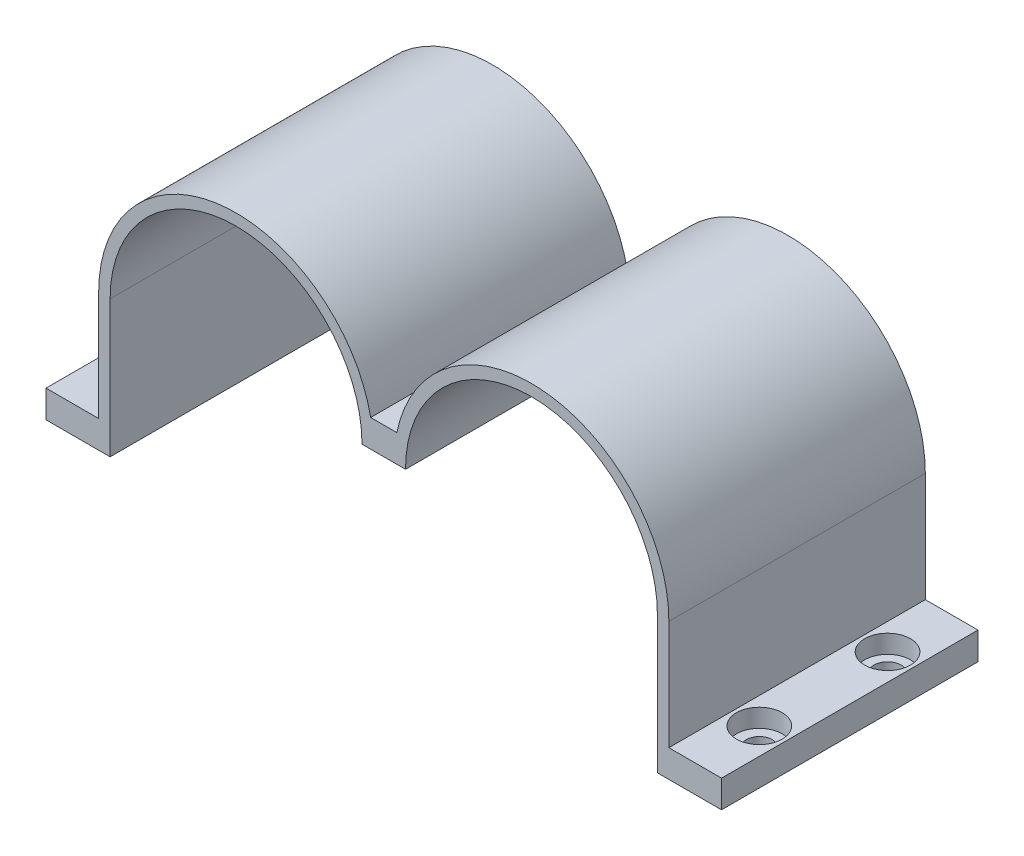
ISO-10303-21;
HEADER;
FILE_DESCRIPTION(('STEP AP214'),'2;1');
FILE_NAME('part.step','',(''),(''),'','','');
FILE_SCHEMA(('AUTOMOTIVE_DESIGN { 1 0 10303 214 1 1 1 1 }'));
ENDSEC;
DATA;
#1=APPLICATION_CONTEXT('core data for automotive mechanical design processes');
#2=APPLICATION_PROTOCOL_DEFINITION('international standard','automotive_design',2000,#1);
#3=PRODUCT_CONTEXT('',#1,'mechanical');
#4=PRODUCT('Part','Part','',(#3));
#5=PRODUCT_RELATED_PRODUCT_CATEGORY('part','',(#4));
#6=PRODUCT_DEFINITION_FORMATION('','',#4);
#7=PRODUCT_DEFINITION_CONTEXT('part definition',#1,'design');
#8=PRODUCT_DEFINITION('design','',#6,#7);
#9=PRODUCT_DEFINITION_SHAPE('','',#8);
#10=(LENGTH_UNIT() NAMED_UNIT(*) SI_UNIT(.MILLI.,.METRE.));
#11=(NAMED_UNIT(*) PLANE_ANGLE_UNIT() SI_UNIT($,.RADIAN.));
#12=(NAMED_UNIT(*) SI_UNIT($,.STERADIAN.) SOLID_ANGLE_UNIT());
#13=UNCERTAINTY_MEASURE_WITH_UNIT(LENGTH_MEASURE(1.E-05),#10,'distance_accuracy_value','');
#14=(GEOMETRIC_REPRESENTATION_CONTEXT(3) GLOBAL_UNCERTAINTY_ASSIGNED_CONTEXT((#13)) GLOBAL_UNIT_ASSIGNED_CONTEXT((#10,
#11,#12)) REPRESENTATION_CONTEXT('',''));
#15=CARTESIAN_POINT('',(0.,0.,0.));
#16=DIRECTION('',(0.,0.,1.));
#17=DIRECTION('',(1.,0.,0.));
#18=AXIS2_PLACEMENT_3D('',#15,#16,#17);
#19=CARTESIAN_POINT('',(31.125,0.,-28.));
#20=DIRECTION('',(1.,0.,0.));
#21=DIRECTION('',(0.,0.,-1.));
#22=AXIS2_PLACEMENT_3D('',#19,#20,#21);
#23=PLANE('',#22);
#24=DIRECTION('',(0.,1.,0.));
#25=VECTOR('',#24,1.);
#26=CARTESIAN_POINT('',(31.125,0.,0.));
#27=LINE('',#26,#25);
#28=CARTESIAN_POINT('',(31.125,-11.9452316579754,0.));
#29=VERTEX_POINT('',#28);
#30=CARTESIAN_POINT('',(31.125,0.,0.));
#31=VERTEX_POINT('',#30);
#32=EDGE_CURVE('E193',#29,#31,#27,.T.);
#33=ORIENTED_EDGE('',*,*,#32,.F.);
#34=DIRECTION('',(0.,0.,1.));
#35=VECTOR('',#34,1.);
#36=CARTESIAN_POINT('',(31.125,-11.9452316579754,-28.));
#37=LINE('',#36,#35);
#38=CARTESIAN_POINT('',(31.125,-11.9452316579754,-28.));
#39=VERTEX_POINT('',#38);
#40=EDGE_CURVE('E11',#39,#29,#37,.T.);
#41=ORIENTED_EDGE('',*,*,#40,.F.);
#42=DIRECTION('',(0.,1.,0.));
#43=VECTOR('',#42,1.);
#44=CARTESIAN_POINT('',(31.125,0.,-28.));
#45=LINE('',#44,#43);
#46=CARTESIAN_POINT('',(31.125,0.,-28.));
#47=VERTEX_POINT('',#46);
#48=EDGE_CURVE('E250',#39,#47,#45,.T.);
#49=ORIENTED_EDGE('',*,*,#48,.T.);
#50=DIRECTION('',(0.,0.,1.));
#51=VECTOR('',#50,1.);
#52=CARTESIAN_POINT('',(31.125,0.,-28.));
#53=LINE('',#52,#51);
#54=EDGE_CURVE('E44',#47,#31,#53,.T.);
#55=ORIENTED_EDGE('',*,*,#54,.T.);
#56=EDGE_LOOP('',(#33,#41,#49,#55));
#57=FACE_BOUND('',#56,.T.);
#58=ADVANCED_FACE('F41',(#57),#23,.T.);
#59=CARTESIAN_POINT('',(0.,-11.9452316579754,-28.));
#60=DIRECTION('',(0.,-1.,0.));
#61=DIRECTION('',(0.,0.,-1.));
#62=AXIS2_PLACEMENT_3D('',#59,#60,#61);
#63=PLANE('',#62);
#64=CARTESIAN_POINT('',(34.,-11.9452316579754,-21.));
#65=DIRECTION('',(0.,1.,0.));
#66=DIRECTION('',(1.,0.,0.));
#67=AXIS2_PLACEMENT_3D('',#64,#65,#66);
#68=CIRCLE('',#67,2.5);
#69=CARTESIAN_POINT('',(36.5,-11.9452316579754,-21.));
#70=VERTEX_POINT('',#69);
#71=EDGE_CURVE('E490',#70,#70,#68,.T.);
#72=ORIENTED_EDGE('',*,*,#71,.F.);
#73=EDGE_LOOP('',(#72));
#74=FACE_BOUND('',#73,.T.);
#75=CARTESIAN_POINT('',(34.,-11.9452316579754,-7.));
#76=DIRECTION('',(0.,1.,0.));
#77=DIRECTION('',(1.,0.,0.));
#78=AXIS2_PLACEMENT_3D('',#75,#76,#77);
#79=CIRCLE('',#78,2.5);
#80=CARTESIAN_POINT('',(36.5,-11.9452316579754,-7.));
#81=VERTEX_POINT('',#80);
#82=EDGE_CURVE('E503',#81,#81,#79,.T.);
#83=ORIENTED_EDGE('',*,*,#82,.F.);
#84=EDGE_LOOP('',(#83));
#85=FACE_BOUND('',#84,.T.);
#86=DIRECTION('',(1.,0.,0.));
#87=VECTOR('',#86,1.);
#88=CARTESIAN_POINT('',(0.,-11.9452316579754,0.));
#89=LINE('',#88,#87);
#90=CARTESIAN_POINT('',(36.875,-11.9452316579754,0.));
#91=VERTEX_POINT('',#90);
#92=EDGE_CURVE('E248',#29,#91,#89,.T.);
#93=ORIENTED_EDGE('',*,*,#92,.T.);
#94=DIRECTION('',(0.,0.,1.));
#95=VECTOR('',#94,1.);
#96=CARTESIAN_POINT('',(36.875,-11.9452316579754,-28.));
#97=LINE('',#96,#95);
#98=CARTESIAN_POINT('',(36.875,-11.9452316579754,-28.));
#99=VERTEX_POINT('',#98);
#100=EDGE_CURVE('E51',#99,#91,#97,.T.);
#101=ORIENTED_EDGE('',*,*,#100,.F.);
#102=DIRECTION('',(1.,0.,0.));
#103=VECTOR('',#102,1.);
#104=CARTESIAN_POINT('',(0.,-11.9452316579754,-28.));
#105=LINE('',#104,#103);
#106=EDGE_CURVE('E179',#39,#99,#105,.T.);
#107=ORIENTED_EDGE('',*,*,#106,.F.);
#108=ORIENTED_EDGE('',*,*,#40,.T.);
#109=EDGE_LOOP('',(#93,#101,#107,#108));
#110=FACE_BOUND('',#109,.T.);
#111=ADVANCED_FACE('F296',(#74,#85,#110),#63,.F.);
#112=CARTESIAN_POINT('',(36.875,0.,-28.));
#113=DIRECTION('',(1.,0.,0.));
#114=DIRECTION('',(0.,0.,-1.));
#115=AXIS2_PLACEMENT_3D('',#112,#113,#114);
#116=PLANE('',#115);
#117=DIRECTION('',(0.,1.,0.));
#118=VECTOR('',#117,1.);
#119=CARTESIAN_POINT('',(36.875,0.,0.));
#120=LINE('',#119,#118);
#121=CARTESIAN_POINT('',(36.875,-14.9452316579754,0.));
#122=VERTEX_POINT('',#121);
#123=EDGE_CURVE('E164',#122,#91,#120,.T.);
#124=ORIENTED_EDGE('',*,*,#123,.F.);
#125=DIRECTION('',(0.,0.,1.));
#126=VECTOR('',#125,1.);
#127=CARTESIAN_POINT('',(36.875,-14.9452316579754,-28.));
#128=LINE('',#127,#126);
#129=CARTESIAN_POINT('',(36.875,-14.9452316579754,-28.));
#130=VERTEX_POINT('',#129);
#131=EDGE_CURVE('E159',#130,#122,#128,.T.);
#132=ORIENTED_EDGE('',*,*,#131,.F.);
#133=DIRECTION('',(0.,1.,0.));
#134=VECTOR('',#133,1.);
#135=CARTESIAN_POINT('',(36.875,0.,-28.));
#136=LINE('',#135,#134);
#137=EDGE_CURVE('E162',#130,#99,#136,.T.);
#138=ORIENTED_EDGE('',*,*,#137,.T.);
#139=ORIENTED_EDGE('',*,*,#100,.T.);
#140=EDGE_LOOP('',(#124,#132,#138,#139));
#141=FACE_BOUND('',#140,.T.);
#142=ADVANCED_FACE('F161',(#141),#116,.T.);
#143=CARTESIAN_POINT('',(0.,-14.9452316579754,-28.));
#144=DIRECTION('',(0.,-1.,0.));
#145=DIRECTION('',(1.,0.,0.));
#146=AXIS2_PLACEMENT_3D('',#143,#144,#145);
#147=PLANE('',#146);
#148=CARTESIAN_POINT('',(34.,-14.9452316579755,-7.));
#149=DIRECTION('',(0.,1.,0.));
#150=DIRECTION('',(-1.,0.,0.));
#151=AXIS2_PLACEMENT_3D('',#148,#149,#150);
#152=CIRCLE('',#151,1.40794910085562);
#153=CARTESIAN_POINT('',(32.5920508991444,-14.9452316579755,-7.));
#154=VERTEX_POINT('',#153);
#155=EDGE_CURVE('E462',#154,#154,#152,.T.);
#156=ORIENTED_EDGE('',*,*,#155,.T.);
#157=EDGE_LOOP('',(#156));
#158=FACE_BOUND('',#157,.T.);
#159=CARTESIAN_POINT('',(34.,-14.9452316579755,-21.));
#160=DIRECTION('',(0.,1.,0.));
#161=DIRECTION('',(-1.,0.,0.));
#162=AXIS2_PLACEMENT_3D('',#159,#160,#161);
#163=CIRCLE('',#162,1.49999999999998);
#164=CARTESIAN_POINT('',(32.5,-14.9452316579755,-21.));
#165=VERTEX_POINT('',#164);
#166=EDGE_CURVE('E742',#165,#165,#163,.T.);
#167=ORIENTED_EDGE('',*,*,#166,.T.);
#168=EDGE_LOOP('',(#167));
#169=FACE_BOUND('',#168,.T.);
#170=DIRECTION('',(1.,0.,0.));
#171=VECTOR('',#170,1.);
#172=CARTESIAN_POINT('',(0.,-14.9452316579754,0.));
#173=LINE('',#172,#171);
#174=CARTESIAN_POINT('',(29.875,-14.9452316579754,0.));
#175=VERTEX_POINT('',#174);
#176=EDGE_CURVE('E243',#175,#122,#173,.T.);
#177=ORIENTED_EDGE('',*,*,#176,.F.);
#178=DIRECTION('',(0.,0.,1.));
#179=VECTOR('',#178,1.);
#180=CARTESIAN_POINT('',(29.875,-14.9452316579754,-28.));
#181=LINE('',#180,#179);
#182=CARTESIAN_POINT('',(29.875,-14.9452316579754,-28.));
#183=VERTEX_POINT('',#182);
#184=EDGE_CURVE('E170',#183,#175,#181,.T.);
#185=ORIENTED_EDGE('',*,*,#184,.F.);
#186=DIRECTION('',(1.,0.,0.));
#187=VECTOR('',#186,1.);
#188=CARTESIAN_POINT('',(0.,-14.9452316579754,-28.));
#189=LINE('',#188,#187);
#190=EDGE_CURVE('E177',#183,#130,#189,.T.);
#191=ORIENTED_EDGE('',*,*,#190,.T.);
#192=ORIENTED_EDGE('',*,*,#131,.T.);
#193=EDGE_LOOP('',(#177,#185,#191,#192));
#194=FACE_BOUND('',#193,.T.);
#195=ADVANCED_FACE('F182',(#158,#169,#194),#147,.T.);
#196=CARTESIAN_POINT('',(29.875,0.,-28.));
#197=DIRECTION('',(-1.,0.,0.));
#198=DIRECTION('',(0.,-1.,0.));
#199=AXIS2_PLACEMENT_3D('',#196,#197,#198);
#200=PLANE('',#199);
#201=DIRECTION('',(0.,-1.,0.));
#202=VECTOR('',#201,1.);
#203=CARTESIAN_POINT('',(29.875,0.,0.));
#204=LINE('',#203,#202);
#205=CARTESIAN_POINT('',(29.875,0.,0.));
#206=VERTEX_POINT('',#205);
#207=EDGE_CURVE('E239',#206,#175,#204,.T.);
#208=ORIENTED_EDGE('',*,*,#207,.F.);
#209=DIRECTION('',(0.,0.,1.));
#210=VECTOR('',#209,1.);
#211=CARTESIAN_POINT('',(29.875,0.,-28.));
#212=LINE('',#211,#210);
#213=CARTESIAN_POINT('',(29.875,0.,-28.));
#214=VERTEX_POINT('',#213);
#215=EDGE_CURVE('E256',#214,#206,#212,.T.);
#216=ORIENTED_EDGE('',*,*,#215,.F.);
#217=DIRECTION('',(0.,-1.,0.));
#218=VECTOR('',#217,1.);
#219=CARTESIAN_POINT('',(29.875,0.,-28.));
#220=LINE('',#219,#218);
#221=EDGE_CURVE('E184',#214,#183,#220,.T.);
#222=ORIENTED_EDGE('',*,*,#221,.T.);
#223=ORIENTED_EDGE('',*,*,#184,.T.);
#224=EDGE_LOOP('',(#208,#216,#222,#223));
#225=FACE_BOUND('',#224,.T.);
#226=ADVANCED_FACE('F383',(#225),#200,.T.);
#227=CARTESIAN_POINT('',(16.125,0.,-28.));
#228=DIRECTION('',(0.,0.,1.));
#229=DIRECTION('',(1.,0.,0.));
#230=AXIS2_PLACEMENT_3D('',#227,#228,#229);
#231=CYLINDRICAL_SURFACE('',#230,13.75);
#232=CARTESIAN_POINT('',(16.125,0.,0.));
#233=DIRECTION('',(0.,0.,1.));
#234=DIRECTION('',(1.,0.,0.));
#235=AXIS2_PLACEMENT_3D('',#232,#233,#234);
#236=CIRCLE('',#235,13.75);
#237=CARTESIAN_POINT('',(2.375,0.,0.));
#238=VERTEX_POINT('',#237);
#239=EDGE_CURVE('E235',#206,#238,#236,.T.);
#240=ORIENTED_EDGE('',*,*,#239,.T.);
#241=DIRECTION('',(0.,0.,1.));
#242=VECTOR('',#241,1.);
#243=CARTESIAN_POINT('',(2.375,0.,-28.));
#244=LINE('',#243,#242);
#245=CARTESIAN_POINT('',(2.375,0.,-28.));
#246=VERTEX_POINT('',#245);
#247=EDGE_CURVE('E259',#246,#238,#244,.T.);
#248=ORIENTED_EDGE('',*,*,#247,.F.);
#249=CARTESIAN_POINT('',(16.125,0.,-28.));
#250=DIRECTION('',(0.,0.,1.));
#251=DIRECTION('',(1.,0.,0.));
#252=AXIS2_PLACEMENT_3D('',#249,#250,#251);
#253=CIRCLE('',#252,13.75);
#254=EDGE_CURVE('E187',#214,#246,#253,.T.);
#255=ORIENTED_EDGE('',*,*,#254,.F.);
#256=ORIENTED_EDGE('',*,*,#215,.T.);
#257=EDGE_LOOP('',(#240,#248,#255,#256));
#258=FACE_BOUND('',#257,.T.);
#259=ADVANCED_FACE('F340',(#258),#231,.F.);
#260=CARTESIAN_POINT('',(0.,0.,-28.));
#261=DIRECTION('',(0.,-1.,0.));
#262=DIRECTION('',(1.,0.,0.));
#263=AXIS2_PLACEMENT_3D('',#260,#261,#262);
#264=PLANE('',#263);
#265=DIRECTION('',(1.,0.,0.));
#266=VECTOR('',#265,1.);
#267=CARTESIAN_POINT('',(0.,0.,0.));
#268=LINE('',#267,#266);
#269=CARTESIAN_POINT('',(-2.375,0.,0.));
#270=VERTEX_POINT('',#269);
#271=EDGE_CURVE('E231',#270,#238,#268,.T.);
#272=ORIENTED_EDGE('',*,*,#271,.F.);
#273=DIRECTION('',(0.,0.,1.));
#274=VECTOR('',#273,1.);
#275=CARTESIAN_POINT('',(-2.375,0.,-28.));
#276=LINE('',#275,#274);
#277=CARTESIAN_POINT('',(-2.375,0.,-28.));
#278=VERTEX_POINT('',#277);
#279=EDGE_CURVE('E262',#278,#270,#276,.T.);
#280=ORIENTED_EDGE('',*,*,#279,.F.);
#281=DIRECTION('',(1.,0.,0.));
#282=VECTOR('',#281,1.);
#283=CARTESIAN_POINT('',(0.,0.,-28.));
#284=LINE('',#283,#282);
#285=EDGE_CURVE('E332',#278,#246,#284,.T.);
#286=ORIENTED_EDGE('',*,*,#285,.T.);
#287=ORIENTED_EDGE('',*,*,#247,.T.);
#288=EDGE_LOOP('',(#272,#280,#286,#287));
#289=FACE_BOUND('',#288,.T.);
#290=ADVANCED_FACE('F344',(#289),#264,.T.);
#291=CARTESIAN_POINT('',(-16.125,0.,-28.));
#292=DIRECTION('',(0.,0.,1.));
#293=DIRECTION('',(1.,0.,0.));
#294=AXIS2_PLACEMENT_3D('',#291,#292,#293);
#295=CYLINDRICAL_SURFACE('',#294,13.75);
#296=CARTESIAN_POINT('',(-16.125,0.,0.));
#297=DIRECTION('',(0.,0.,1.));
#298=DIRECTION('',(1.,0.,0.));
#299=AXIS2_PLACEMENT_3D('',#296,#297,#298);
#300=CIRCLE('',#299,13.75);
#301=CARTESIAN_POINT('',(-29.875,0.,0.));
#302=VERTEX_POINT('',#301);
#303=EDGE_CURVE('E228',#270,#302,#300,.T.);
#304=ORIENTED_EDGE('',*,*,#303,.T.);
#305=DIRECTION('',(0.,0.,1.));
#306=VECTOR('',#305,1.);
#307=CARTESIAN_POINT('',(-29.875,0.,-28.));
#308=LINE('',#307,#306);
#309=CARTESIAN_POINT('',(-29.875,0.,-28.));
#310=VERTEX_POINT('',#309);
#311=EDGE_CURVE('E265',#310,#302,#308,.T.);
#312=ORIENTED_EDGE('',*,*,#311,.F.);
#313=CARTESIAN_POINT('',(-16.125,0.,-28.));
#314=DIRECTION('',(0.,0.,1.));
#315=DIRECTION('',(1.,0.,0.));
#316=AXIS2_PLACEMENT_3D('',#313,#314,#315);
#317=CIRCLE('',#316,13.75);
#318=EDGE_CURVE('E329',#278,#310,#317,.T.);
#319=ORIENTED_EDGE('',*,*,#318,.F.);
#320=ORIENTED_EDGE('',*,*,#279,.T.);
#321=EDGE_LOOP('',(#304,#312,#319,#320));
#322=FACE_BOUND('',#321,.T.);
#323=ADVANCED_FACE('F349',(#322),#295,.F.);
#324=CARTESIAN_POINT('',(-29.875,0.,-28.));
#325=DIRECTION('',(-1.,0.,0.));
#326=DIRECTION('',(0.,-1.,0.));
#327=AXIS2_PLACEMENT_3D('',#324,#325,#326);
#328=PLANE('',#327);
#329=DIRECTION('',(0.,-1.,0.));
#330=VECTOR('',#329,1.);
#331=CARTESIAN_POINT('',(-29.875,0.,0.));
#332=LINE('',#331,#330);
#333=CARTESIAN_POINT('',(-29.875,-14.9452316579754,0.));
#334=VERTEX_POINT('',#333);
#335=EDGE_CURVE('E225',#302,#334,#332,.T.);
#336=ORIENTED_EDGE('',*,*,#335,.T.);
#337=DIRECTION('',(0.,0.,1.));
#338=VECTOR('',#337,1.);
#339=CARTESIAN_POINT('',(-29.875,-14.9452316579754,-28.));
#340=LINE('',#339,#338);
#341=CARTESIAN_POINT('',(-29.875,-14.9452316579754,-28.));
#342=VERTEX_POINT('',#341);
#343=EDGE_CURVE('E269',#342,#334,#340,.T.);
#344=ORIENTED_EDGE('',*,*,#343,.F.);
#345=DIRECTION('',(0.,-1.,0.));
#346=VECTOR('',#345,1.);
#347=CARTESIAN_POINT('',(-29.875,0.,-28.));
#348=LINE('',#347,#346);
#349=EDGE_CURVE('E326',#310,#342,#348,.T.);
#350=ORIENTED_EDGE('',*,*,#349,.F.);
#351=ORIENTED_EDGE('',*,*,#311,.T.);
#352=EDGE_LOOP('',(#336,#344,#350,#351));
#353=FACE_BOUND('',#352,.T.);
#354=ADVANCED_FACE('F355',(#353),#328,.F.);
#355=CARTESIAN_POINT('',(0.,-14.9452316579754,-28.));
#356=DIRECTION('',(0.,1.,0.));
#357=DIRECTION('',(0.,0.,1.));
#358=AXIS2_PLACEMENT_3D('',#355,#356,#357);
#359=PLANE('',#358);
#360=CARTESIAN_POINT('',(-34.,-14.9452316579755,-7.));
#361=DIRECTION('',(0.,1.,0.));
#362=DIRECTION('',(-1.,0.,0.));
#363=AXIS2_PLACEMENT_3D('',#360,#361,#362);
#364=CIRCLE('',#363,1.40794910085564);
#365=CARTESIAN_POINT('',(-35.4079491008556,-14.9452316579755,-7.));
#366=VERTEX_POINT('',#365);
#367=EDGE_CURVE('E473',#366,#366,#364,.T.);
#368=ORIENTED_EDGE('',*,*,#367,.T.);
#369=EDGE_LOOP('',(#368));
#370=FACE_BOUND('',#369,.T.);
#371=CARTESIAN_POINT('',(-34.,-14.9452316579755,-21.));
#372=DIRECTION('',(0.,1.,0.));
#373=DIRECTION('',(-1.,0.,0.));
#374=AXIS2_PLACEMENT_3D('',#371,#372,#373);
#375=CIRCLE('',#374,1.5);
#376=CARTESIAN_POINT('',(-35.5,-14.9452316579755,-21.));
#377=VERTEX_POINT('',#376);
#378=EDGE_CURVE('E467',#377,#377,#375,.T.);
#379=ORIENTED_EDGE('',*,*,#378,.T.);
#380=EDGE_LOOP('',(#379));
#381=FACE_BOUND('',#380,.T.);
#382=DIRECTION('',(-1.,0.,0.));
#383=VECTOR('',#382,1.);
#384=CARTESIAN_POINT('',(0.,-14.9452316579754,0.));
#385=LINE('',#384,#383);
#386=CARTESIAN_POINT('',(-36.875,-14.9452316579754,0.));
#387=VERTEX_POINT('',#386);
#388=EDGE_CURVE('E222',#334,#387,#385,.T.);
#389=ORIENTED_EDGE('',*,*,#388,.T.);
#390=DIRECTION('',(0.,0.,1.));
#391=VECTOR('',#390,1.);
#392=CARTESIAN_POINT('',(-36.875,-14.9452316579754,-28.));
#393=LINE('',#392,#391);
#394=CARTESIAN_POINT('',(-36.875,-14.9452316579754,-28.));
#395=VERTEX_POINT('',#394);
#396=EDGE_CURVE('E273',#395,#387,#393,.T.);
#397=ORIENTED_EDGE('',*,*,#396,.F.);
#398=DIRECTION('',(-1.,0.,0.));
#399=VECTOR('',#398,1.);
#400=CARTESIAN_POINT('',(0.,-14.9452316579754,-28.));
#401=LINE('',#400,#399);
#402=EDGE_CURVE('E323',#342,#395,#401,.T.);
#403=ORIENTED_EDGE('',*,*,#402,.F.);
#404=ORIENTED_EDGE('',*,*,#343,.T.);
#405=EDGE_LOOP('',(#389,#397,#403,#404));
#406=FACE_BOUND('',#405,.T.);
#407=ADVANCED_FACE('F359',(#370,#381,#406),#359,.F.);
#408=CARTESIAN_POINT('',(-36.875,0.,-28.));
#409=DIRECTION('',(1.,0.,0.));
#410=DIRECTION('',(0.,0.,-1.));
#411=AXIS2_PLACEMENT_3D('',#408,#409,#410);
#412=PLANE('',#411);
#413=DIRECTION('',(0.,1.,0.));
#414=VECTOR('',#413,1.);
#415=CARTESIAN_POINT('',(-36.875,0.,0.));
#416=LINE('',#415,#414);
#417=CARTESIAN_POINT('',(-36.875,-11.9452316579754,0.));
#418=VERTEX_POINT('',#417);
#419=EDGE_CURVE('E218',#387,#418,#416,.T.);
#420=ORIENTED_EDGE('',*,*,#419,.T.);
#421=DIRECTION('',(0.,0.,1.));
#422=VECTOR('',#421,1.);
#423=CARTESIAN_POINT('',(-36.875,-11.9452316579754,-28.));
#424=LINE('',#423,#422);
#425=CARTESIAN_POINT('',(-36.875,-11.9452316579754,-28.));
#426=VERTEX_POINT('',#425);
#427=EDGE_CURVE('E277',#426,#418,#424,.T.);
#428=ORIENTED_EDGE('',*,*,#427,.F.);
#429=DIRECTION('',(0.,1.,0.));
#430=VECTOR('',#429,1.);
#431=CARTESIAN_POINT('',(-36.875,0.,-28.));
#432=LINE('',#431,#430);
#433=EDGE_CURVE('E320',#395,#426,#432,.T.);
#434=ORIENTED_EDGE('',*,*,#433,.F.);
#435=ORIENTED_EDGE('',*,*,#396,.T.);
#436=EDGE_LOOP('',(#420,#428,#434,#435));
#437=FACE_BOUND('',#436,.T.);
#438=ADVANCED_FACE('F364',(#437),#412,.F.);
#439=CARTESIAN_POINT('',(0.,-11.9452316579754,-28.));
#440=DIRECTION('',(0.,1.,0.));
#441=DIRECTION('',(-1.,0.,0.));
#442=AXIS2_PLACEMENT_3D('',#439,#440,#441);
#443=PLANE('',#442);
#444=CARTESIAN_POINT('',(-34.,-11.9452316579754,-7.));
#445=DIRECTION('',(0.,1.,0.));
#446=DIRECTION('',(-1.,0.,0.));
#447=AXIS2_PLACEMENT_3D('',#444,#445,#446);
#448=CIRCLE('',#447,2.5);
#449=CARTESIAN_POINT('',(-36.5,-11.9452316579754,-7.));
#450=VERTEX_POINT('',#449);
#451=EDGE_CURVE('E495',#450,#450,#448,.T.);
#452=ORIENTED_EDGE('',*,*,#451,.F.);
#453=EDGE_LOOP('',(#452));
#454=FACE_BOUND('',#453,.T.);
#455=CARTESIAN_POINT('',(-34.,-11.9452316579754,-21.));
#456=DIRECTION('',(0.,1.,0.));
#457=DIRECTION('',(-1.,0.,0.));
#458=AXIS2_PLACEMENT_3D('',#455,#456,#457);
#459=CIRCLE('',#458,2.5);
#460=CARTESIAN_POINT('',(-36.5,-11.9452316579754,-21.));
#461=VERTEX_POINT('',#460);
#462=EDGE_CURVE('E304',#461,#461,#459,.T.);
#463=ORIENTED_EDGE('',*,*,#462,.F.);
#464=EDGE_LOOP('',(#463));
#465=FACE_BOUND('',#464,.T.);
#466=DIRECTION('',(-1.,0.,0.));
#467=VECTOR('',#466,1.);
#468=CARTESIAN_POINT('',(0.,-11.9452316579754,0.));
#469=LINE('',#468,#467);
#470=CARTESIAN_POINT('',(-31.125,-11.9452316579754,0.));
#471=VERTEX_POINT('',#470);
#472=EDGE_CURVE('E214',#471,#418,#469,.T.);
#473=ORIENTED_EDGE('',*,*,#472,.F.);
#474=DIRECTION('',(0.,0.,1.));
#475=VECTOR('',#474,1.);
#476=CARTESIAN_POINT('',(-31.125,-11.9452316579754,-28.));
#477=LINE('',#476,#475);
#478=CARTESIAN_POINT('',(-31.125,-11.9452316579754,-28.));
#479=VERTEX_POINT('',#478);
#480=EDGE_CURVE('E280',#479,#471,#477,.T.);
#481=ORIENTED_EDGE('',*,*,#480,.F.);
#482=DIRECTION('',(-1.,0.,0.));
#483=VECTOR('',#482,1.);
#484=CARTESIAN_POINT('',(0.,-11.9452316579754,-28.));
#485=LINE('',#484,#483);
#486=EDGE_CURVE('E316',#479,#426,#485,.T.);
#487=ORIENTED_EDGE('',*,*,#486,.T.);
#488=ORIENTED_EDGE('',*,*,#427,.T.);
#489=EDGE_LOOP('',(#473,#481,#487,#488));
#490=FACE_BOUND('',#489,.T.);
#491=ADVANCED_FACE('F371',(#454,#465,#490),#443,.T.);
#492=CARTESIAN_POINT('',(-31.125,0.,-28.));
#493=DIRECTION('',(1.,0.,0.));
#494=DIRECTION('',(0.,0.,-1.));
#495=AXIS2_PLACEMENT_3D('',#492,#493,#494);
#496=PLANE('',#495);
#497=DIRECTION('',(0.,1.,0.));
#498=VECTOR('',#497,1.);
#499=CARTESIAN_POINT('',(-31.125,0.,0.));
#500=LINE('',#499,#498);
#501=CARTESIAN_POINT('',(-31.125,0.,0.));
#502=VERTEX_POINT('',#501);
#503=EDGE_CURVE('E210',#471,#502,#500,.T.);
#504=ORIENTED_EDGE('',*,*,#503,.T.);
#505=DIRECTION('',(0.,0.,1.));
#506=VECTOR('',#505,1.);
#507=CARTESIAN_POINT('',(-31.125,0.,-28.));
#508=LINE('',#507,#506);
#509=CARTESIAN_POINT('',(-31.125,0.,-28.));
#510=VERTEX_POINT('',#509);
#511=EDGE_CURVE('E283',#510,#502,#508,.T.);
#512=ORIENTED_EDGE('',*,*,#511,.F.);
#513=DIRECTION('',(0.,1.,0.));
#514=VECTOR('',#513,1.);
#515=CARTESIAN_POINT('',(-31.125,0.,-28.));
#516=LINE('',#515,#514);
#517=EDGE_CURVE('E313',#479,#510,#516,.T.);
#518=ORIENTED_EDGE('',*,*,#517,.F.);
#519=ORIENTED_EDGE('',*,*,#480,.T.);
#520=EDGE_LOOP('',(#504,#512,#518,#519));
#521=FACE_BOUND('',#520,.T.);
#522=ADVANCED_FACE('F374',(#521),#496,.F.);
#523=CARTESIAN_POINT('',(-16.125,0.,-28.));
#524=DIRECTION('',(0.,0.,1.));
#525=DIRECTION('',(1.,0.,0.));
#526=AXIS2_PLACEMENT_3D('',#523,#524,#525);
#527=CYLINDRICAL_SURFACE('',#526,15.);
#528=CARTESIAN_POINT('',(-16.125,0.,0.));
#529=DIRECTION('',(0.,0.,1.));
#530=DIRECTION('',(1.,0.,0.));
#531=AXIS2_PLACEMENT_3D('',#528,#529,#530);
#532=CIRCLE('',#531,15.);
#533=CARTESIAN_POINT('',(-1.42806154330093,3.,0.));
#534=VERTEX_POINT('',#533);
#535=EDGE_CURVE('E206',#534,#502,#532,.T.);
#536=ORIENTED_EDGE('',*,*,#535,.F.);
#537=DIRECTION('',(0.,0.,1.));
#538=VECTOR('',#537,1.);
#539=CARTESIAN_POINT('',(-1.42806154330093,3.,-28.));
#540=LINE('',#539,#538);
#541=CARTESIAN_POINT('',(-1.42806154330093,3.,-28.));
#542=VERTEX_POINT('',#541);
#543=EDGE_CURVE('E286',#542,#534,#540,.T.);
#544=ORIENTED_EDGE('',*,*,#543,.F.);
#545=CARTESIAN_POINT('',(-16.125,0.,-28.));
#546=DIRECTION('',(0.,0.,1.));
#547=DIRECTION('',(1.,0.,0.));
#548=AXIS2_PLACEMENT_3D('',#545,#546,#547);
#549=CIRCLE('',#548,15.);
#550=EDGE_CURVE('E309',#542,#510,#549,.T.);
#551=ORIENTED_EDGE('',*,*,#550,.T.);
#552=ORIENTED_EDGE('',*,*,#511,.T.);
#553=EDGE_LOOP('',(#536,#544,#551,#552));
#554=FACE_BOUND('',#553,.T.);
#555=ADVANCED_FACE('F377',(#554),#527,.T.);
#556=CARTESIAN_POINT('',(0.,3.,-28.));
#557=DIRECTION('',(0.,-1.,0.));
#558=DIRECTION('',(1.,0.,0.));
#559=AXIS2_PLACEMENT_3D('',#556,#557,#558);
#560=PLANE('',#559);
#561=DIRECTION('',(1.,0.,0.));
#562=VECTOR('',#561,1.);
#563=CARTESIAN_POINT('',(0.,3.,0.));
#564=LINE('',#563,#562);
#565=CARTESIAN_POINT('',(1.42806154330093,3.,0.));
#566=VERTEX_POINT('',#565);
#567=EDGE_CURVE('E202',#534,#566,#564,.T.);
#568=ORIENTED_EDGE('',*,*,#567,.T.);
#569=DIRECTION('',(0.,0.,1.));
#570=VECTOR('',#569,1.);
#571=CARTESIAN_POINT('',(1.42806154330093,3.,-28.));
#572=LINE('',#571,#570);
#573=CARTESIAN_POINT('',(1.42806154330093,3.,-28.));
#574=VERTEX_POINT('',#573);
#575=EDGE_CURVE('E288',#574,#566,#572,.T.);
#576=ORIENTED_EDGE('',*,*,#575,.F.);
#577=DIRECTION('',(1.,0.,0.));
#578=VECTOR('',#577,1.);
#579=CARTESIAN_POINT('',(0.,3.,-28.));
#580=LINE('',#579,#578);
#581=EDGE_CURVE('E301',#542,#574,#580,.T.);
#582=ORIENTED_EDGE('',*,*,#581,.F.);
#583=ORIENTED_EDGE('',*,*,#543,.T.);
#584=EDGE_LOOP('',(#568,#576,#582,#583));
#585=FACE_BOUND('',#584,.T.);
#586=ADVANCED_FACE('F380',(#585),#560,.F.);
#587=CARTESIAN_POINT('',(16.125,0.,-28.));
#588=DIRECTION('',(0.,0.,1.));
#589=DIRECTION('',(1.,0.,0.));
#590=AXIS2_PLACEMENT_3D('',#587,#588,#589);
#591=CYLINDRICAL_SURFACE('',#590,15.);
#592=CARTESIAN_POINT('',(16.125,0.,0.));
#593=DIRECTION('',(0.,0.,1.));
#594=DIRECTION('',(1.,0.,0.));
#595=AXIS2_PLACEMENT_3D('',#592,#593,#594);
#596=CIRCLE('',#595,15.);
#597=EDGE_CURVE('E197',#31,#566,#596,.T.);
#598=ORIENTED_EDGE('',*,*,#597,.F.);
#599=ORIENTED_EDGE('',*,*,#54,.F.);
#600=CARTESIAN_POINT('',(16.125,0.,-28.));
#601=DIRECTION('',(0.,0.,1.));
#602=DIRECTION('',(1.,0.,0.));
#603=AXIS2_PLACEMENT_3D('',#600,#601,#602);
#604=CIRCLE('',#603,15.);
#605=EDGE_CURVE('E297',#47,#574,#604,.T.);
#606=ORIENTED_EDGE('',*,*,#605,.T.);
#607=ORIENTED_EDGE('',*,*,#575,.T.);
#608=EDGE_LOOP('',(#598,#599,#606,#607));
#609=FACE_BOUND('',#608,.T.);
#610=ADVANCED_FACE('F292',(#609),#591,.T.);
#611=CARTESIAN_POINT('',(0.,0.,-28.));
#612=DIRECTION('',(0.,0.,1.));
#613=DIRECTION('',(1.,0.,0.));
#614=AXIS2_PLACEMENT_3D('',#611,#612,#613);
#615=PLANE('',#614);
#616=ORIENTED_EDGE('',*,*,#48,.F.);
#617=ORIENTED_EDGE('',*,*,#106,.T.);
#618=ORIENTED_EDGE('',*,*,#137,.F.);
#619=ORIENTED_EDGE('',*,*,#190,.F.);
#620=ORIENTED_EDGE('',*,*,#221,.F.);
#621=ORIENTED_EDGE('',*,*,#254,.T.);
#622=ORIENTED_EDGE('',*,*,#285,.F.);
#623=ORIENTED_EDGE('',*,*,#318,.T.);
#624=ORIENTED_EDGE('',*,*,#349,.T.);
#625=ORIENTED_EDGE('',*,*,#402,.T.);
#626=ORIENTED_EDGE('',*,*,#433,.T.);
#627=ORIENTED_EDGE('',*,*,#486,.F.);
#628=ORIENTED_EDGE('',*,*,#517,.T.);
#629=ORIENTED_EDGE('',*,*,#550,.F.);
#630=ORIENTED_EDGE('',*,*,#581,.T.);
#631=ORIENTED_EDGE('',*,*,#605,.F.);
#632=EDGE_LOOP('',(#616,#617,#618,#619,#620,#621,#622,#623,#624,#625,#626,#627,#628,#629,#630,#631));
#633=FACE_BOUND('',#632,.T.);
#634=ADVANCED_FACE('F175',(#633),#615,.F.);
#635=CARTESIAN_POINT('',(0.,0.,0.));
#636=DIRECTION('',(0.,0.,1.));
#637=DIRECTION('',(1.,0.,0.));
#638=AXIS2_PLACEMENT_3D('',#635,#636,#637);
#639=PLANE('',#638);
#640=ORIENTED_EDGE('',*,*,#32,.T.);
#641=ORIENTED_EDGE('',*,*,#597,.T.);
#642=ORIENTED_EDGE('',*,*,#567,.F.);
#643=ORIENTED_EDGE('',*,*,#535,.T.);
#644=ORIENTED_EDGE('',*,*,#503,.F.);
#645=ORIENTED_EDGE('',*,*,#472,.T.);
#646=ORIENTED_EDGE('',*,*,#419,.F.);
#647=ORIENTED_EDGE('',*,*,#388,.F.);
#648=ORIENTED_EDGE('',*,*,#335,.F.);
#649=ORIENTED_EDGE('',*,*,#303,.F.);
#650=ORIENTED_EDGE('',*,*,#271,.T.);
#651=ORIENTED_EDGE('',*,*,#239,.F.);
#652=ORIENTED_EDGE('',*,*,#207,.T.);
#653=ORIENTED_EDGE('',*,*,#176,.T.);
#654=ORIENTED_EDGE('',*,*,#123,.T.);
#655=ORIENTED_EDGE('',*,*,#92,.F.);
#656=EDGE_LOOP('',(#640,#641,#642,#643,#644,#645,#646,#647,#648,#649,#650,#651,#652,#653,#654,#655));
#657=FACE_BOUND('',#656,.T.);
#658=ADVANCED_FACE('F295',(#657),#639,.T.);
#659=CARTESIAN_POINT('',(-34.,-13.9452316579754,-21.));
#660=DIRECTION('',(0.,1.,0.));
#661=DIRECTION('',(-1.,0.,0.));
#662=AXIS2_PLACEMENT_3D('',#659,#660,#661);
#663=CYLINDRICAL_SURFACE('',#662,2.5);
#664=CARTESIAN_POINT('',(-34.,-13.9452316579754,-21.));
#665=DIRECTION('',(0.,1.,0.));
#666=DIRECTION('',(-1.,0.,0.));
#667=AXIS2_PLACEMENT_3D('',#664,#665,#666);
#668=CIRCLE('',#667,2.5);
#669=CARTESIAN_POINT('',(-36.5,-13.9452316579754,-21.));
#670=VERTEX_POINT('',#669);
#671=EDGE_CURVE('E198',#670,#670,#668,.T.);
#672=ORIENTED_EDGE('',*,*,#671,.F.);
#673=EDGE_LOOP('',(#672));
#674=FACE_BOUND('',#673,.T.);
#675=ORIENTED_EDGE('',*,*,#462,.T.);
#676=EDGE_LOOP('',(#675));
#677=FACE_BOUND('',#676,.T.);
#678=ADVANCED_FACE('F408',(#674,#677),#663,.F.);
#679=CARTESIAN_POINT('',(-34.,-13.9452316579754,-21.));
#680=DIRECTION('',(0.,1.,0.));
#681=DIRECTION('',(-1.,0.,0.));
#682=AXIS2_PLACEMENT_3D('',#679,#680,#681);
#683=PLANE('',#682);
#684=CARTESIAN_POINT('',(-34.,-13.9452316579754,-21.));
#685=DIRECTION('',(0.,1.,0.));
#686=DIRECTION('',(-1.,0.,0.));
#687=AXIS2_PLACEMENT_3D('',#684,#685,#686);
#688=CIRCLE('',#687,1.5);
#689=CARTESIAN_POINT('',(-35.5,-13.9452316579754,-21.));
#690=VERTEX_POINT('',#689);
#691=EDGE_CURVE('E486',#690,#690,#688,.T.);
#692=ORIENTED_EDGE('',*,*,#691,.F.);
#693=EDGE_LOOP('',(#692));
#694=FACE_BOUND('',#693,.T.);
#695=ORIENTED_EDGE('',*,*,#671,.T.);
#696=EDGE_LOOP('',(#695));
#697=FACE_BOUND('',#696,.T.);
#698=ADVANCED_FACE('F413',(#694,#697),#683,.T.);
#699=CARTESIAN_POINT('',(-34.,-13.9452316579754,-7.));
#700=DIRECTION('',(0.,1.,0.));
#701=DIRECTION('',(-1.,0.,0.));
#702=AXIS2_PLACEMENT_3D('',#699,#700,#701);
#703=CYLINDRICAL_SURFACE('',#702,2.5);
#704=CARTESIAN_POINT('',(-34.,-13.9452316579754,-7.));
#705=DIRECTION('',(0.,1.,0.));
#706=DIRECTION('',(-1.,0.,0.));
#707=AXIS2_PLACEMENT_3D('',#704,#705,#706);
#708=CIRCLE('',#707,2.5);
#709=CARTESIAN_POINT('',(-36.5,-13.9452316579754,-7.));
#710=VERTEX_POINT('',#709);
#711=EDGE_CURVE('E491',#710,#710,#708,.T.);
#712=ORIENTED_EDGE('',*,*,#711,.F.);
#713=EDGE_LOOP('',(#712));
#714=FACE_BOUND('',#713,.T.);
#715=ORIENTED_EDGE('',*,*,#451,.T.);
#716=EDGE_LOOP('',(#715));
#717=FACE_BOUND('',#716,.T.);
#718=ADVANCED_FACE('F417',(#714,#717),#703,.F.);
#719=CARTESIAN_POINT('',(-34.,-13.9452316579754,-7.));
#720=DIRECTION('',(0.,1.,0.));
#721=DIRECTION('',(-1.,0.,0.));
#722=AXIS2_PLACEMENT_3D('',#719,#720,#721);
#723=PLANE('',#722);
#724=CARTESIAN_POINT('',(-34.,-13.9452316579754,-7.));
#725=DIRECTION('',(0.,1.,0.));
#726=DIRECTION('',(-1.,0.,0.));
#727=AXIS2_PLACEMENT_3D('',#724,#725,#726);
#728=CIRCLE('',#727,1.40794910085564);
#729=CARTESIAN_POINT('',(-35.4079491008556,-13.9452316579754,-7.));
#730=VERTEX_POINT('',#729);
#731=EDGE_CURVE('E481',#730,#730,#728,.T.);
#732=ORIENTED_EDGE('',*,*,#731,.F.);
#733=EDGE_LOOP('',(#732));
#734=FACE_BOUND('',#733,.T.);
#735=ORIENTED_EDGE('',*,*,#711,.T.);
#736=EDGE_LOOP('',(#735));
#737=FACE_BOUND('',#736,.T.);
#738=ADVANCED_FACE('F432',(#734,#737),#723,.T.);
#739=CARTESIAN_POINT('',(34.,-13.9452316579754,-7.));
#740=DIRECTION('',(0.,1.,0.));
#741=DIRECTION('',(-1.,0.,0.));
#742=AXIS2_PLACEMENT_3D('',#739,#740,#741);
#743=CYLINDRICAL_SURFACE('',#742,2.5);
#744=CARTESIAN_POINT('',(34.,-13.9452316579754,-7.));
#745=DIRECTION('',(0.,1.,0.));
#746=DIRECTION('',(1.,0.,0.));
#747=AXIS2_PLACEMENT_3D('',#744,#745,#746);
#748=CIRCLE('',#747,2.5);
#749=CARTESIAN_POINT('',(36.5,-13.9452316579754,-7.));
#750=VERTEX_POINT('',#749);
#751=EDGE_CURVE('E499',#750,#750,#748,.T.);
#752=ORIENTED_EDGE('',*,*,#751,.F.);
#753=EDGE_LOOP('',(#752));
#754=FACE_BOUND('',#753,.T.);
#755=ORIENTED_EDGE('',*,*,#82,.T.);
#756=EDGE_LOOP('',(#755));
#757=FACE_BOUND('',#756,.T.);
#758=ADVANCED_FACE('F429',(#754,#757),#743,.F.);
#759=CARTESIAN_POINT('',(34.,-13.9452316579754,-7.));
#760=DIRECTION('',(0.,-1.,0.));
#761=DIRECTION('',(1.,0.,0.));
#762=AXIS2_PLACEMENT_3D('',#759,#760,#761);
#763=PLANE('',#762);
#764=CARTESIAN_POINT('',(34.,-13.9452316579754,-7.));
#765=DIRECTION('',(0.,-1.,0.));
#766=DIRECTION('',(1.,0.,0.));
#767=AXIS2_PLACEMENT_3D('',#764,#765,#766);
#768=CIRCLE('',#767,1.40794910085562);
#769=CARTESIAN_POINT('',(32.5920508991444,-13.9452316579754,-7.));
#770=VERTEX_POINT('',#769);
#771=EDGE_CURVE('E465',#770,#770,#768,.T.);
#772=ORIENTED_EDGE('',*,*,#771,.T.);
#773=EDGE_LOOP('',(#772));
#774=FACE_BOUND('',#773,.T.);
#775=ORIENTED_EDGE('',*,*,#751,.T.);
#776=EDGE_LOOP('',(#775));
#777=FACE_BOUND('',#776,.T.);
#778=ADVANCED_FACE('F423',(#774,#777),#763,.F.);
#779=CARTESIAN_POINT('',(34.,-13.9452316579754,-21.));
#780=DIRECTION('',(0.,1.,0.));
#781=DIRECTION('',(-1.,0.,0.));
#782=AXIS2_PLACEMENT_3D('',#779,#780,#781);
#783=CYLINDRICAL_SURFACE('',#782,2.5);
#784=CARTESIAN_POINT('',(34.,-13.9452316579754,-21.));
#785=DIRECTION('',(0.,1.,0.));
#786=DIRECTION('',(1.,0.,0.));
#787=AXIS2_PLACEMENT_3D('',#784,#785,#786);
#788=CIRCLE('',#787,2.5);
#789=CARTESIAN_POINT('',(36.5,-13.9452316579754,-21.));
#790=VERTEX_POINT('',#789);
#791=EDGE_CURVE('E507',#790,#790,#788,.T.);
#792=ORIENTED_EDGE('',*,*,#791,.F.);
#793=EDGE_LOOP('',(#792));
#794=FACE_BOUND('',#793,.T.);
#795=ORIENTED_EDGE('',*,*,#71,.T.);
#796=EDGE_LOOP('',(#795));
#797=FACE_BOUND('',#796,.T.);
#798=ADVANCED_FACE('F419',(#794,#797),#783,.F.);
#799=CARTESIAN_POINT('',(34.,-13.9452316579754,-21.));
#800=DIRECTION('',(0.,-1.,0.));
#801=DIRECTION('',(1.,0.,0.));
#802=AXIS2_PLACEMENT_3D('',#799,#800,#801);
#803=PLANE('',#802);
#804=CARTESIAN_POINT('',(34.,-13.9452316579754,-21.));
#805=DIRECTION('',(0.,-1.,0.));
#806=DIRECTION('',(1.,0.,0.));
#807=AXIS2_PLACEMENT_3D('',#804,#805,#806);
#808=CIRCLE('',#807,1.49999999999998);
#809=CARTESIAN_POINT('',(32.5,-13.9452316579754,-21.));
#810=VERTEX_POINT('',#809);
#811=EDGE_CURVE('E468',#810,#810,#808,.T.);
#812=ORIENTED_EDGE('',*,*,#811,.T.);
#813=EDGE_LOOP('',(#812));
#814=FACE_BOUND('',#813,.T.);
#815=ORIENTED_EDGE('',*,*,#791,.T.);
#816=EDGE_LOOP('',(#815));
#817=FACE_BOUND('',#816,.T.);
#818=ADVANCED_FACE('F422',(#814,#817),#803,.F.);
#819=CARTESIAN_POINT('',(-34.,-14.9452316579755,-7.));
#820=DIRECTION('',(0.,1.,0.));
#821=DIRECTION('',(-1.,0.,0.));
#822=AXIS2_PLACEMENT_3D('',#819,#820,#821);
#823=CYLINDRICAL_SURFACE('',#822,1.40794910085564);
#824=ORIENTED_EDGE('',*,*,#731,.T.);
#825=EDGE_LOOP('',(#824));
#826=FACE_BOUND('',#825,.T.);
#827=ORIENTED_EDGE('',*,*,#367,.F.);
#828=EDGE_LOOP('',(#827));
#829=FACE_BOUND('',#828,.T.);
#830=ADVANCED_FACE('F427',(#826,#829),#823,.F.);
#831=CARTESIAN_POINT('',(-34.,-14.9452316579755,-21.));
#832=DIRECTION('',(0.,1.,0.));
#833=DIRECTION('',(-1.,0.,0.));
#834=AXIS2_PLACEMENT_3D('',#831,#832,#833);
#835=CYLINDRICAL_SURFACE('',#834,1.5);
#836=ORIENTED_EDGE('',*,*,#691,.T.);
#837=EDGE_LOOP('',(#836));
#838=FACE_BOUND('',#837,.T.);
#839=ORIENTED_EDGE('',*,*,#378,.F.);
#840=EDGE_LOOP('',(#839));
#841=FACE_BOUND('',#840,.T.);
#842=ADVANCED_FACE('F443',(#838,#841),#835,.F.);
#843=CARTESIAN_POINT('',(34.,-14.9452316579755,-21.));
#844=DIRECTION('',(0.,1.,0.));
#845=DIRECTION('',(-1.,0.,0.));
#846=AXIS2_PLACEMENT_3D('',#843,#844,#845);
#847=CYLINDRICAL_SURFACE('',#846,1.49999999999998);
#848=CARTESIAN_POINT('',(32.5,-14.9452316579755,-21.));
#849=CARTESIAN_POINT('',(32.5,-14.9348149913088,-21.));
#850=CARTESIAN_POINT('',(32.5,-14.9243983246421,-21.));
#851=CARTESIAN_POINT('',(32.5,-14.9035649913088,-21.));
#852=CARTESIAN_POINT('',(32.5,-14.8931483246421,-21.));
#853=CARTESIAN_POINT('',(32.5,-14.8723149913088,-21.));
#854=CARTESIAN_POINT('',(32.5,-14.8618983246421,-21.));
#855=CARTESIAN_POINT('',(32.5,-14.8410649913088,-21.));
#856=CARTESIAN_POINT('',(32.5,-14.8306483246421,-21.));
#857=CARTESIAN_POINT('',(32.5,-14.8098149913088,-21.));
#858=CARTESIAN_POINT('',(32.5,-14.7993983246421,-21.));
#859=CARTESIAN_POINT('',(32.5,-14.7785649913088,-21.));
#860=CARTESIAN_POINT('',(32.5,-14.7681483246421,-21.));
#861=CARTESIAN_POINT('',(32.5,-14.7473149913088,-21.));
#862=CARTESIAN_POINT('',(32.5,-14.7368983246421,-21.));
#863=CARTESIAN_POINT('',(32.5,-14.7160649913088,-21.));
#864=CARTESIAN_POINT('',(32.5,-14.7056483246421,-21.));
#865=CARTESIAN_POINT('',(32.5,-14.6848149913088,-21.));
#866=CARTESIAN_POINT('',(32.5,-14.6743983246421,-21.));
#867=CARTESIAN_POINT('',(32.5,-14.6535649913088,-21.));
#868=CARTESIAN_POINT('',(32.5,-14.6431483246421,-21.));
#869=CARTESIAN_POINT('',(32.5,-14.6223149913088,-21.));
#870=CARTESIAN_POINT('',(32.5,-14.6118983246421,-21.));
#871=CARTESIAN_POINT('',(32.5,-14.5910649913088,-21.));
#872=CARTESIAN_POINT('',(32.5,-14.5806483246421,-21.));
#873=CARTESIAN_POINT('',(32.5,-14.5598149913088,-21.));
#874=CARTESIAN_POINT('',(32.5,-14.5493983246421,-21.));
#875=CARTESIAN_POINT('',(32.5,-14.5285649913088,-21.));
#876=CARTESIAN_POINT('',(32.5,-14.5181483246421,-21.));
#877=CARTESIAN_POINT('',(32.5,-14.4973149913088,-21.));
#878=CARTESIAN_POINT('',(32.5,-14.4868983246421,-21.));
#879=CARTESIAN_POINT('',(32.5,-14.4660649913088,-21.));
#880=CARTESIAN_POINT('',(32.5,-14.4556483246421,-21.));
#881=CARTESIAN_POINT('',(32.5,-14.4348149913088,-21.));
#882=CARTESIAN_POINT('',(32.5,-14.4243983246421,-21.));
#883=CARTESIAN_POINT('',(32.5,-14.4035649913088,-21.));
#884=CARTESIAN_POINT('',(32.5,-14.3931483246421,-21.));
#885=CARTESIAN_POINT('',(32.5,-14.3723149913088,-21.));
#886=CARTESIAN_POINT('',(32.5,-14.3618983246421,-21.));
#887=CARTESIAN_POINT('',(32.5,-14.3410649913088,-21.));
#888=CARTESIAN_POINT('',(32.5,-14.3306483246421,-21.));
#889=CARTESIAN_POINT('',(32.5,-14.3098149913088,-21.));
#890=CARTESIAN_POINT('',(32.5,-14.2993983246421,-21.));
#891=CARTESIAN_POINT('',(32.5,-14.2785649913088,-21.));
#892=CARTESIAN_POINT('',(32.5,-14.2681483246421,-21.));
#893=CARTESIAN_POINT('',(32.5,-14.2473149913088,-21.));
#894=CARTESIAN_POINT('',(32.5,-14.2368983246421,-21.));
#895=CARTESIAN_POINT('',(32.5,-14.2160649913088,-21.));
#896=CARTESIAN_POINT('',(32.5,-14.2056483246421,-21.));
#897=CARTESIAN_POINT('',(32.5,-14.1848149913088,-21.));
#898=CARTESIAN_POINT('',(32.5,-14.1743983246421,-21.));
#899=CARTESIAN_POINT('',(32.5,-14.1535649913088,-21.));
#900=CARTESIAN_POINT('',(32.5,-14.1431483246421,-21.));
#901=CARTESIAN_POINT('',(32.5,-14.1223149913088,-21.));
#902=CARTESIAN_POINT('',(32.5,-14.1118983246421,-21.));
#903=CARTESIAN_POINT('',(32.5,-14.0910649913088,-21.));
#904=CARTESIAN_POINT('',(32.5,-14.0806483246421,-21.));
#905=CARTESIAN_POINT('',(32.5,-14.0598149913088,-21.));
#906=CARTESIAN_POINT('',(32.5,-14.0493983246421,-21.));
#907=CARTESIAN_POINT('',(32.5,-14.0285649913088,-21.));
#908=CARTESIAN_POINT('',(32.5,-14.0181483246421,-21.));
#909=CARTESIAN_POINT('',(32.5,-13.9973149913088,-21.));
#910=CARTESIAN_POINT('',(32.5,-13.9868983246421,-21.));
#911=CARTESIAN_POINT('',(32.5,-13.9660649913088,-21.));
#912=CARTESIAN_POINT('',(32.5,-13.9556483246421,-21.));
#913=CARTESIAN_POINT('',(32.5,-13.9452316579754,-21.));
#914=B_SPLINE_CURVE_WITH_KNOTS('',3,(#848,#849,#850,#851,#852,#853,#854,#855,#856,#857,#858,
#859,#860,#861,#862,#863,#864,#865,#866,#867,#868,#869,#870,#871,#872,#873,#874,#875,#876,#877,
#878,#879,#880,#881,#882,#883,#884,#885,#886,#887,#888,#889,#890,#891,#892,#893,#894,#895,#896,
#897,#898,#899,#900,#901,#902,#903,#904,#905,#906,#907,#908,#909,#910,#911,#912,#913),
.UNSPECIFIED.,.F.,.F.,(4,2,2,2,2,2,2,2,2,2,2,2,2,2,2,2,2,2,2,2,2,2,2,2,2,2,2,2,2,2,2,2,4),(0.,
0.03125,0.0625000000000018,0.0937500000000036,0.125000000000005,0.156250000000007,
0.187500000000009,0.218750000000011,0.250000000000012,0.281250000000014,0.312500000000016,
0.343750000000018,0.375000000000018,0.406250000000019,0.437500000000021,0.468750000000023,
0.500000000000025,0.531250000000027,0.562500000000028,0.59375000000003,0.625000000000032,
0.656250000000034,0.687500000000035,0.718750000000035,0.750000000000037,0.781250000000039,
0.812500000000041,0.843750000000042,0.875000000000044,0.906250000000046,0.937500000000048,
0.968750000000049,1.00000000000005),.UNSPECIFIED.);
#915=EDGE_CURVE('BSEAM446',#165,#810,#914,.T.);
#916=ORIENTED_EDGE('',*,*,#166,.F.);
#917=ORIENTED_EDGE('',*,*,#811,.F.);
#918=ORIENTED_EDGE('',*,*,#915,.T.);
#919=ORIENTED_EDGE('',*,*,#915,.F.);
#920=EDGE_LOOP('',(#916,#918,#917,#919));
#921=FACE_BOUND('',#920,.T.);
#922=ADVANCED_FACE('F446',(#921),#847,.F.);
#923=CARTESIAN_POINT('',(34.,-14.9452316579755,-7.));
#924=DIRECTION('',(0.,1.,0.));
#925=DIRECTION('',(-1.,0.,0.));
#926=AXIS2_PLACEMENT_3D('',#923,#924,#925);
#927=CYLINDRICAL_SURFACE('',#926,1.40794910085562);
#928=CARTESIAN_POINT('',(32.5920508991444,-14.9452316579755,-7.));
#929=CARTESIAN_POINT('',(32.5920508991444,-14.9348149913088,-7.));
#930=CARTESIAN_POINT('',(32.5920508991444,-14.9243983246421,-7.));
#931=CARTESIAN_POINT('',(32.5920508991444,-14.9035649913088,-7.));
#932=CARTESIAN_POINT('',(32.5920508991444,-14.8931483246421,-7.));
#933=CARTESIAN_POINT('',(32.5920508991444,-14.8723149913088,-7.));
#934=CARTESIAN_POINT('',(32.5920508991444,-14.8618983246421,-7.));
#935=CARTESIAN_POINT('',(32.5920508991444,-14.8410649913088,-7.));
#936=CARTESIAN_POINT('',(32.5920508991444,-14.8306483246421,-7.));
#937=CARTESIAN_POINT('',(32.5920508991444,-14.8098149913088,-7.));
#938=CARTESIAN_POINT('',(32.5920508991444,-14.7993983246421,-7.));
#939=CARTESIAN_POINT('',(32.5920508991444,-14.7785649913088,-7.));
#940=CARTESIAN_POINT('',(32.5920508991444,-14.7681483246421,-7.));
#941=CARTESIAN_POINT('',(32.5920508991444,-14.7473149913088,-7.));
#942=CARTESIAN_POINT('',(32.5920508991444,-14.7368983246421,-7.));
#943=CARTESIAN_POINT('',(32.5920508991444,-14.7160649913088,-7.));
#944=CARTESIAN_POINT('',(32.5920508991444,-14.7056483246421,-7.));
#945=CARTESIAN_POINT('',(32.5920508991444,-14.6848149913088,-7.));
#946=CARTESIAN_POINT('',(32.5920508991444,-14.6743983246421,-7.));
#947=CARTESIAN_POINT('',(32.5920508991444,-14.6535649913088,-7.));
#948=CARTESIAN_POINT('',(32.5920508991444,-14.6431483246421,-7.));
#949=CARTESIAN_POINT('',(32.5920508991444,-14.6223149913088,-7.));
#950=CARTESIAN_POINT('',(32.5920508991444,-14.6118983246421,-7.));
#951=CARTESIAN_POINT('',(32.5920508991444,-14.5910649913088,-7.));
#952=CARTESIAN_POINT('',(32.5920508991444,-14.5806483246421,-7.));
#953=CARTESIAN_POINT('',(32.5920508991444,-14.5598149913088,-7.));
#954=CARTESIAN_POINT('',(32.5920508991444,-14.5493983246421,-7.));
#955=CARTESIAN_POINT('',(32.5920508991444,-14.5285649913088,-7.));
#956=CARTESIAN_POINT('',(32.5920508991444,-14.5181483246421,-7.));
#957=CARTESIAN_POINT('',(32.5920508991444,-14.4973149913088,-7.));
#958=CARTESIAN_POINT('',(32.5920508991444,-14.4868983246421,-7.));
#959=CARTESIAN_POINT('',(32.5920508991444,-14.4660649913088,-7.));
#960=CARTESIAN_POINT('',(32.5920508991444,-14.4556483246421,-7.));
#961=CARTESIAN_POINT('',(32.5920508991444,-14.4348149913088,-7.));
#962=CARTESIAN_POINT('',(32.5920508991444,-14.4243983246421,-7.));
#963=CARTESIAN_POINT('',(32.5920508991444,-14.4035649913088,-7.));
#964=CARTESIAN_POINT('',(32.5920508991444,-14.3931483246421,-7.));
#965=CARTESIAN_POINT('',(32.5920508991444,-14.3723149913088,-7.));
#966=CARTESIAN_POINT('',(32.5920508991444,-14.3618983246421,-7.));
#967=CARTESIAN_POINT('',(32.5920508991444,-14.3410649913088,-7.));
#968=CARTESIAN_POINT('',(32.5920508991444,-14.3306483246421,-7.));
#969=CARTESIAN_POINT('',(32.5920508991444,-14.3098149913088,-7.));
#970=CARTESIAN_POINT('',(32.5920508991444,-14.2993983246421,-7.));
#971=CARTESIAN_POINT('',(32.5920508991444,-14.2785649913088,-7.));
#972=CARTESIAN_POINT('',(32.5920508991444,-14.2681483246421,-7.));
#973=CARTESIAN_POINT('',(32.5920508991444,-14.2473149913088,-7.));
#974=CARTESIAN_POINT('',(32.5920508991444,-14.2368983246421,-7.));
#975=CARTESIAN_POINT('',(32.5920508991444,-14.2160649913088,-7.));
#976=CARTESIAN_POINT('',(32.5920508991444,-14.2056483246421,-7.));
#977=CARTESIAN_POINT('',(32.5920508991444,-14.1848149913088,-7.));
#978=CARTESIAN_POINT('',(32.5920508991444,-14.1743983246421,-7.));
#979=CARTESIAN_POINT('',(32.5920508991444,-14.1535649913088,-7.));
#980=CARTESIAN_POINT('',(32.5920508991444,-14.1431483246421,-7.));
#981=CARTESIAN_POINT('',(32.5920508991444,-14.1223149913088,-7.));
#982=CARTESIAN_POINT('',(32.5920508991444,-14.1118983246421,-7.));
#983=CARTESIAN_POINT('',(32.5920508991444,-14.0910649913088,-7.));
#984=CARTESIAN_POINT('',(32.5920508991444,-14.0806483246421,-7.));
#985=CARTESIAN_POINT('',(32.5920508991444,-14.0598149913088,-7.));
#986=CARTESIAN_POINT('',(32.5920508991444,-14.0493983246421,-7.));
#987=CARTESIAN_POINT('',(32.5920508991444,-14.0285649913088,-7.));
#988=CARTESIAN_POINT('',(32.5920508991444,-14.0181483246421,-7.));
#989=CARTESIAN_POINT('',(32.5920508991444,-13.9973149913088,-7.));
#990=CARTESIAN_POINT('',(32.5920508991444,-13.9868983246421,-7.));
#991=CARTESIAN_POINT('',(32.5920508991444,-13.9660649913088,-7.));
#992=CARTESIAN_POINT('',(32.5920508991444,-13.9556483246421,-7.));
#993=CARTESIAN_POINT('',(32.5920508991444,-13.9452316579754,-7.));
#994=B_SPLINE_CURVE_WITH_KNOTS('',3,(#928,#929,#930,#931,#932,#933,#934,#935,#936,#937,#938,
#939,#940,#941,#942,#943,#944,#945,#946,#947,#948,#949,#950,#951,#952,#953,#954,#955,#956,#957,
#958,#959,#960,#961,#962,#963,#964,#965,#966,#967,#968,#969,#970,#971,#972,#973,#974,#975,#976,
#977,#978,#979,#980,#981,#982,#983,#984,#985,#986,#987,#988,#989,#990,#991,#992,#993),
.UNSPECIFIED.,.F.,.F.,(4,2,2,2,2,2,2,2,2,2,2,2,2,2,2,2,2,2,2,2,2,2,2,2,2,2,2,2,2,2,2,2,4),(0.,
0.03125,0.0625000000000018,0.0937500000000036,0.125000000000005,0.156250000000007,
0.187500000000009,0.218750000000011,0.250000000000012,0.281250000000014,0.312500000000016,
0.343750000000018,0.375000000000018,0.406250000000019,0.437500000000021,0.468750000000023,
0.500000000000025,0.531250000000027,0.562500000000028,0.59375000000003,0.625000000000032,
0.656250000000034,0.687500000000035,0.718750000000035,0.750000000000037,0.781250000000039,
0.812500000000041,0.843750000000042,0.875000000000044,0.906250000000046,0.937500000000048,
0.968750000000049,1.00000000000005),.UNSPECIFIED.);
#995=EDGE_CURVE('BSEAM453',#154,#770,#994,.T.);
#996=ORIENTED_EDGE('',*,*,#155,.F.);
#997=ORIENTED_EDGE('',*,*,#771,.F.);
#998=ORIENTED_EDGE('',*,*,#995,.T.);
#999=ORIENTED_EDGE('',*,*,#995,.F.);
#1000=EDGE_LOOP('',(#996,#998,#997,#999));
#1001=FACE_BOUND('',#1000,.T.);
#1002=ADVANCED_FACE('F453',(#1001),#927,.F.);
#1003=CLOSED_SHELL('',(#58,#111,#142,#195,#226,#259,#290,#323,#354,#407,#438,#491,#522,#555,
#586,#610,#634,#658,#678,#698,#718,#738,#758,#778,#798,#818,#830,#842,#922,#1002));
#1004=MANIFOLD_SOLID_BREP('B2',#1003);
#1005=ADVANCED_BREP_SHAPE_REPRESENTATION('',(#18,#1004),#14);
#1006=SHAPE_DEFINITION_REPRESENTATION(#9,#1005);
ENDSEC;
END-ISO-10303-21;
